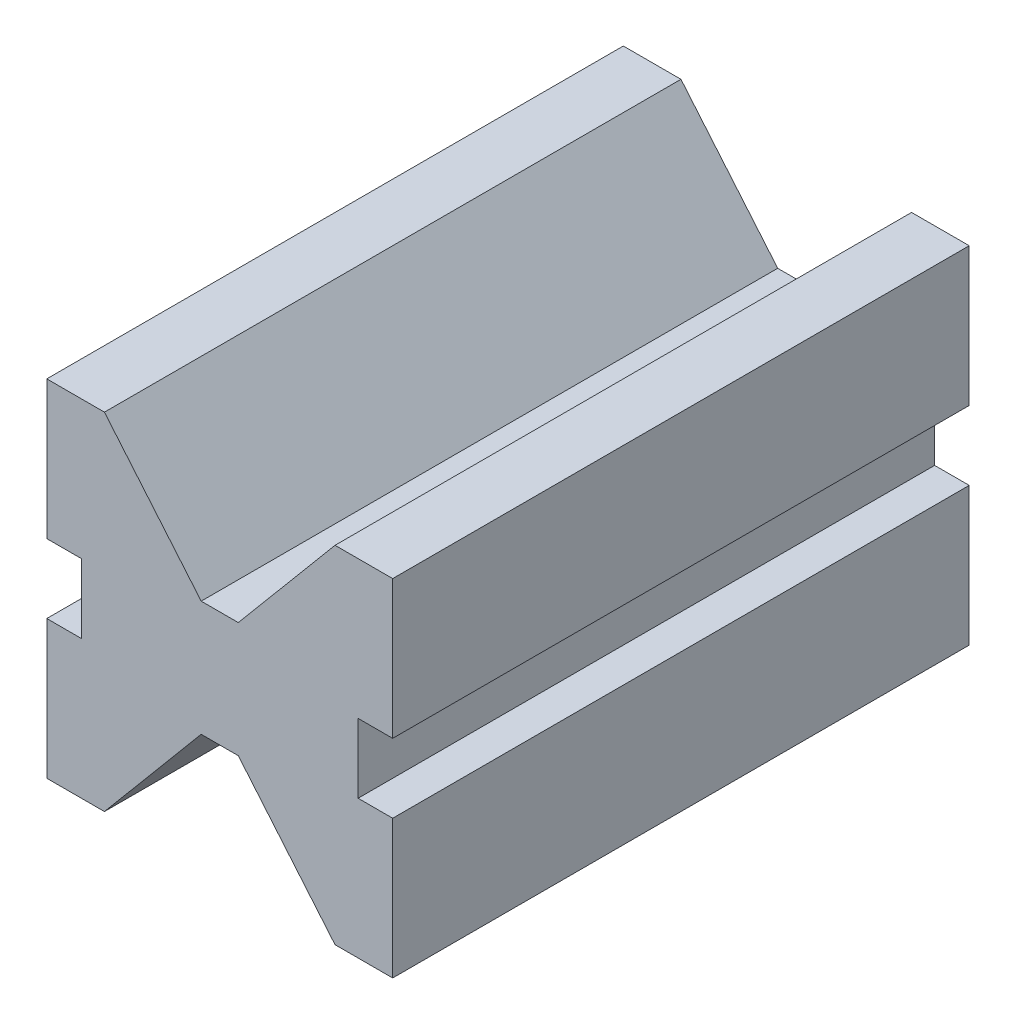
ISO-10303-21;
HEADER;
FILE_DESCRIPTION(('STEP AP214'),'2;1');
FILE_NAME('part.step','',(''),(''),'','','');
FILE_SCHEMA(('AUTOMOTIVE_DESIGN { 1 0 10303 214 1 1 1 1 }'));
ENDSEC;
DATA;
#1=APPLICATION_CONTEXT('core data for automotive mechanical design processes');
#2=APPLICATION_PROTOCOL_DEFINITION('international standard','automotive_design',2000,#1);
#3=PRODUCT_CONTEXT('',#1,'mechanical');
#4=PRODUCT('Part','Part','',(#3));
#5=PRODUCT_RELATED_PRODUCT_CATEGORY('part','',(#4));
#6=PRODUCT_DEFINITION_FORMATION('','',#4);
#7=PRODUCT_DEFINITION_CONTEXT('part definition',#1,'design');
#8=PRODUCT_DEFINITION('design','',#6,#7);
#9=PRODUCT_DEFINITION_SHAPE('','',#8);
#10=(LENGTH_UNIT() NAMED_UNIT(*) SI_UNIT(.MILLI.,.METRE.));
#11=(NAMED_UNIT(*) PLANE_ANGLE_UNIT() SI_UNIT($,.RADIAN.));
#12=(NAMED_UNIT(*) SI_UNIT($,.STERADIAN.) SOLID_ANGLE_UNIT());
#13=UNCERTAINTY_MEASURE_WITH_UNIT(LENGTH_MEASURE(1.E-05),#10,'distance_accuracy_value','');
#14=(GEOMETRIC_REPRESENTATION_CONTEXT(3) GLOBAL_UNCERTAINTY_ASSIGNED_CONTEXT((#13)) GLOBAL_UNIT_ASSIGNED_CONTEXT((#10,
#11,#12)) REPRESENTATION_CONTEXT('',''));
#15=CARTESIAN_POINT('',(0.,0.,0.));
#16=DIRECTION('',(0.,0.,1.));
#17=DIRECTION('',(1.,0.,0.));
#18=AXIS2_PLACEMENT_3D('',#15,#16,#17);
#19=CARTESIAN_POINT('',(30.,0.,50.));
#20=DIRECTION('',(1.,0.,0.));
#21=DIRECTION('',(0.,0.,-1.));
#22=AXIS2_PLACEMENT_3D('',#19,#20,#21);
#23=PLANE('',#22);
#24=DIRECTION('',(0.,-1.,0.));
#25=VECTOR('',#24,1.);
#26=CARTESIAN_POINT('',(30.,0.,-50.));
#27=LINE('',#26,#25);
#28=CARTESIAN_POINT('',(30.,-6.,-50.));
#29=VERTEX_POINT('',#28);
#30=CARTESIAN_POINT('',(30.,-30.,-50.));
#31=VERTEX_POINT('',#30);
#32=EDGE_CURVE('E211',#29,#31,#27,.T.);
#33=ORIENTED_EDGE('',*,*,#32,.F.);
#34=DIRECTION('',(0.,0.,-1.));
#35=VECTOR('',#34,1.);
#36=CARTESIAN_POINT('',(30.,-6.,50.));
#37=LINE('',#36,#35);
#38=CARTESIAN_POINT('',(30.,-6.,50.));
#39=VERTEX_POINT('',#38);
#40=EDGE_CURVE('E11',#39,#29,#37,.T.);
#41=ORIENTED_EDGE('',*,*,#40,.F.);
#42=DIRECTION('',(0.,-1.,0.));
#43=VECTOR('',#42,1.);
#44=CARTESIAN_POINT('',(30.,0.,50.));
#45=LINE('',#44,#43);
#46=CARTESIAN_POINT('',(30.,-30.,50.));
#47=VERTEX_POINT('',#46);
#48=EDGE_CURVE('E282',#39,#47,#45,.T.);
#49=ORIENTED_EDGE('',*,*,#48,.T.);
#50=DIRECTION('',(0.,0.,-1.));
#51=VECTOR('',#50,1.);
#52=CARTESIAN_POINT('',(30.,-30.,50.));
#53=LINE('',#52,#51);
#54=EDGE_CURVE('E128',#47,#31,#53,.T.);
#55=ORIENTED_EDGE('',*,*,#54,.T.);
#56=EDGE_LOOP('',(#33,#41,#49,#55));
#57=FACE_BOUND('',#56,.T.);
#58=ADVANCED_FACE('F41',(#57),#23,.T.);
#59=CARTESIAN_POINT('',(0.,-6.00000000000001,50.));
#60=DIRECTION('',(0.,-1.,0.));
#61=DIRECTION('',(1.,0.,0.));
#62=AXIS2_PLACEMENT_3D('',#59,#60,#61);
#63=PLANE('',#62);
#64=DIRECTION('',(-1.,0.,0.));
#65=VECTOR('',#64,1.);
#66=CARTESIAN_POINT('',(0.,-6.00000000000001,-50.));
#67=LINE('',#66,#65);
#68=CARTESIAN_POINT('',(24.,-6.,-50.));
#69=VERTEX_POINT('',#68);
#70=EDGE_CURVE('E215',#29,#69,#67,.T.);
#71=ORIENTED_EDGE('',*,*,#70,.T.);
#72=DIRECTION('',(0.,0.,-1.));
#73=VECTOR('',#72,1.);
#74=CARTESIAN_POINT('',(24.,-6.,50.));
#75=LINE('',#74,#73);
#76=CARTESIAN_POINT('',(24.,-6.,50.));
#77=VERTEX_POINT('',#76);
#78=EDGE_CURVE('E50',#77,#69,#75,.T.);
#79=ORIENTED_EDGE('',*,*,#78,.F.);
#80=DIRECTION('',(-1.,0.,0.));
#81=VECTOR('',#80,1.);
#82=CARTESIAN_POINT('',(0.,-6.00000000000001,50.));
#83=LINE('',#82,#81);
#84=EDGE_CURVE('E363',#39,#77,#83,.T.);
#85=ORIENTED_EDGE('',*,*,#84,.F.);
#86=ORIENTED_EDGE('',*,*,#40,.T.);
#87=EDGE_LOOP('',(#71,#79,#85,#86));
#88=FACE_BOUND('',#87,.T.);
#89=ADVANCED_FACE('F413',(#88),#63,.F.);
#90=CARTESIAN_POINT('',(24.,0.,50.));
#91=DIRECTION('',(-1.,0.,0.));
#92=DIRECTION('',(0.,0.,1.));
#93=AXIS2_PLACEMENT_3D('',#90,#91,#92);
#94=PLANE('',#93);
#95=DIRECTION('',(0.,1.,0.));
#96=VECTOR('',#95,1.);
#97=CARTESIAN_POINT('',(24.,0.,-50.));
#98=LINE('',#97,#96);
#99=CARTESIAN_POINT('',(24.,6.,-50.));
#100=VERTEX_POINT('',#99);
#101=EDGE_CURVE('E218',#69,#100,#98,.T.);
#102=ORIENTED_EDGE('',*,*,#101,.T.);
#103=DIRECTION('',(0.,0.,-1.));
#104=VECTOR('',#103,1.);
#105=CARTESIAN_POINT('',(24.,6.,50.));
#106=LINE('',#105,#104);
#107=CARTESIAN_POINT('',(24.,6.,50.));
#108=VERTEX_POINT('',#107);
#109=EDGE_CURVE('E331',#108,#100,#106,.T.);
#110=ORIENTED_EDGE('',*,*,#109,.F.);
#111=DIRECTION('',(0.,1.,0.));
#112=VECTOR('',#111,1.);
#113=CARTESIAN_POINT('',(24.,0.,50.));
#114=LINE('',#113,#112);
#115=EDGE_CURVE('E342',#77,#108,#114,.T.);
#116=ORIENTED_EDGE('',*,*,#115,.F.);
#117=ORIENTED_EDGE('',*,*,#78,.T.);
#118=EDGE_LOOP('',(#102,#110,#116,#117));
#119=FACE_BOUND('',#118,.T.);
#120=ADVANCED_FACE('F340',(#119),#94,.F.);
#121=CARTESIAN_POINT('',(0.,6.,50.));
#122=DIRECTION('',(0.,1.,0.));
#123=DIRECTION('',(0.,0.,1.));
#124=AXIS2_PLACEMENT_3D('',#121,#122,#123);
#125=PLANE('',#124);
#126=DIRECTION('',(1.,0.,0.));
#127=VECTOR('',#126,1.);
#128=CARTESIAN_POINT('',(0.,6.,-50.));
#129=LINE('',#128,#127);
#130=CARTESIAN_POINT('',(30.,6.,-50.));
#131=VERTEX_POINT('',#130);
#132=EDGE_CURVE('E221',#100,#131,#129,.T.);
#133=ORIENTED_EDGE('',*,*,#132,.T.);
#134=DIRECTION('',(0.,0.,-1.));
#135=VECTOR('',#134,1.);
#136=CARTESIAN_POINT('',(30.,6.,50.));
#137=LINE('',#136,#135);
#138=CARTESIAN_POINT('',(30.,6.,50.));
#139=VERTEX_POINT('',#138);
#140=EDGE_CURVE('E328',#139,#131,#137,.T.);
#141=ORIENTED_EDGE('',*,*,#140,.F.);
#142=DIRECTION('',(1.,0.,0.));
#143=VECTOR('',#142,1.);
#144=CARTESIAN_POINT('',(0.,6.,50.));
#145=LINE('',#144,#143);
#146=EDGE_CURVE('E354',#108,#139,#145,.T.);
#147=ORIENTED_EDGE('',*,*,#146,.F.);
#148=ORIENTED_EDGE('',*,*,#109,.T.);
#149=EDGE_LOOP('',(#133,#141,#147,#148));
#150=FACE_BOUND('',#149,.T.);
#151=ADVANCED_FACE('F351',(#150),#125,.F.);
#152=CARTESIAN_POINT('',(30.,0.,50.));
#153=DIRECTION('',(1.,0.,0.));
#154=DIRECTION('',(0.,1.,0.));
#155=AXIS2_PLACEMENT_3D('',#152,#153,#154);
#156=PLANE('',#155);
#157=DIRECTION('',(0.,-1.,0.));
#158=VECTOR('',#157,1.);
#159=CARTESIAN_POINT('',(30.,0.,-50.));
#160=LINE('',#159,#158);
#161=CARTESIAN_POINT('',(30.,30.,-50.));
#162=VERTEX_POINT('',#161);
#163=EDGE_CURVE('E225',#162,#131,#160,.T.);
#164=ORIENTED_EDGE('',*,*,#163,.F.);
#165=DIRECTION('',(0.,0.,-1.));
#166=VECTOR('',#165,1.);
#167=CARTESIAN_POINT('',(30.,30.,50.));
#168=LINE('',#167,#166);
#169=CARTESIAN_POINT('',(30.,30.,50.));
#170=VERTEX_POINT('',#169);
#171=EDGE_CURVE('E325',#170,#162,#168,.T.);
#172=ORIENTED_EDGE('',*,*,#171,.F.);
#173=DIRECTION('',(0.,-1.,0.));
#174=VECTOR('',#173,1.);
#175=CARTESIAN_POINT('',(30.,0.,50.));
#176=LINE('',#175,#174);
#177=EDGE_CURVE('E357',#170,#139,#176,.T.);
#178=ORIENTED_EDGE('',*,*,#177,.T.);
#179=ORIENTED_EDGE('',*,*,#140,.T.);
#180=EDGE_LOOP('',(#164,#172,#178,#179));
#181=FACE_BOUND('',#180,.T.);
#182=ADVANCED_FACE('F423',(#181),#156,.T.);
#183=CARTESIAN_POINT('',(0.,30.,50.));
#184=DIRECTION('',(0.,1.,0.));
#185=DIRECTION('',(0.,0.,1.));
#186=AXIS2_PLACEMENT_3D('',#183,#184,#185);
#187=PLANE('',#186);
#188=DIRECTION('',(1.,0.,0.));
#189=VECTOR('',#188,1.);
#190=CARTESIAN_POINT('',(0.,30.,-50.));
#191=LINE('',#190,#189);
#192=CARTESIAN_POINT('',(20.,30.,-50.));
#193=VERTEX_POINT('',#192);
#194=EDGE_CURVE('E229',#193,#162,#191,.T.);
#195=ORIENTED_EDGE('',*,*,#194,.F.);
#196=DIRECTION('',(0.,0.,-1.));
#197=VECTOR('',#196,1.);
#198=CARTESIAN_POINT('',(20.,30.,50.));
#199=LINE('',#198,#197);
#200=CARTESIAN_POINT('',(20.,30.,50.));
#201=VERTEX_POINT('',#200);
#202=EDGE_CURVE('E322',#201,#193,#199,.T.);
#203=ORIENTED_EDGE('',*,*,#202,.F.);
#204=DIRECTION('',(1.,0.,0.));
#205=VECTOR('',#204,1.);
#206=CARTESIAN_POINT('',(0.,30.,50.));
#207=LINE('',#206,#205);
#208=EDGE_CURVE('E361',#201,#170,#207,.T.);
#209=ORIENTED_EDGE('',*,*,#208,.T.);
#210=ORIENTED_EDGE('',*,*,#171,.T.);
#211=EDGE_LOOP('',(#195,#203,#209,#210));
#212=FACE_BOUND('',#211,.T.);
#213=ADVANCED_FACE('F426',(#212),#187,.T.);
#214=CARTESIAN_POINT('',(-3.03563451851394,2.5471998048741,50.));
#215=DIRECTION('',(0.766044443118974,-0.642787609686543,0.));
#216=DIRECTION('',(0.642787609686544,0.766044443118975,0.));
#217=AXIS2_PLACEMENT_3D('',#214,#215,#216);
#218=PLANE('',#217);
#219=DIRECTION('',(-0.642787609686543,-0.766044443118975,0.));
#220=VECTOR('',#219,1.);
#221=CARTESIAN_POINT('',(-3.03563451851394,2.5471998048741,-50.));
#222=LINE('',#221,#220);
#223=CARTESIAN_POINT('',(3.21800737645423,10.,-50.));
#224=VERTEX_POINT('',#223);
#225=EDGE_CURVE('E233',#193,#224,#222,.T.);
#226=ORIENTED_EDGE('',*,*,#225,.T.);
#227=DIRECTION('',(0.,0.,-1.));
#228=VECTOR('',#227,1.);
#229=CARTESIAN_POINT('',(3.21800737645423,10.,50.));
#230=LINE('',#229,#228);
#231=CARTESIAN_POINT('',(3.21800737645423,10.,50.));
#232=VERTEX_POINT('',#231);
#233=EDGE_CURVE('E318',#232,#224,#230,.T.);
#234=ORIENTED_EDGE('',*,*,#233,.F.);
#235=DIRECTION('',(-0.642787609686543,-0.766044443118975,0.));
#236=VECTOR('',#235,1.);
#237=CARTESIAN_POINT('',(-3.03563451851394,2.5471998048741,50.));
#238=LINE('',#237,#236);
#239=EDGE_CURVE('E370',#201,#232,#238,.T.);
#240=ORIENTED_EDGE('',*,*,#239,.F.);
#241=ORIENTED_EDGE('',*,*,#202,.T.);
#242=EDGE_LOOP('',(#226,#234,#240,#241));
#243=FACE_BOUND('',#242,.T.);
#244=ADVANCED_FACE('F430',(#243),#218,.F.);
#245=CARTESIAN_POINT('',(0.,10.,50.));
#246=DIRECTION('',(0.,-1.,0.));
#247=DIRECTION('',(0.,0.,-1.));
#248=AXIS2_PLACEMENT_3D('',#245,#246,#247);
#249=PLANE('',#248);
#250=DIRECTION('',(-1.,0.,0.));
#251=VECTOR('',#250,1.);
#252=CARTESIAN_POINT('',(0.,10.,-50.));
#253=LINE('',#252,#251);
#254=CARTESIAN_POINT('',(-3.2180073764542,10.,-50.));
#255=VERTEX_POINT('',#254);
#256=EDGE_CURVE('E236',#224,#255,#253,.T.);
#257=ORIENTED_EDGE('',*,*,#256,.T.);
#258=DIRECTION('',(0.,0.,-1.));
#259=VECTOR('',#258,1.);
#260=CARTESIAN_POINT('',(-3.2180073764542,10.,50.));
#261=LINE('',#260,#259);
#262=CARTESIAN_POINT('',(-3.2180073764542,10.,50.));
#263=VERTEX_POINT('',#262);
#264=EDGE_CURVE('E314',#263,#255,#261,.T.);
#265=ORIENTED_EDGE('',*,*,#264,.F.);
#266=DIRECTION('',(-1.,0.,0.));
#267=VECTOR('',#266,1.);
#268=CARTESIAN_POINT('',(0.,10.,50.));
#269=LINE('',#268,#267);
#270=EDGE_CURVE('E373',#232,#263,#269,.T.);
#271=ORIENTED_EDGE('',*,*,#270,.F.);
#272=ORIENTED_EDGE('',*,*,#233,.T.);
#273=EDGE_LOOP('',(#257,#265,#271,#272));
#274=FACE_BOUND('',#273,.T.);
#275=ADVANCED_FACE('F434',(#274),#249,.F.);
#276=CARTESIAN_POINT('',(3.03563451851396,2.54719980487411,50.));
#277=DIRECTION('',(-0.766044443118974,-0.642787609686543,0.));
#278=DIRECTION('',(0.642787609686544,-0.766044443118975,0.));
#279=AXIS2_PLACEMENT_3D('',#276,#277,#278);
#280=PLANE('',#279);
#281=DIRECTION('',(-0.642787609686543,0.766044443118975,0.));
#282=VECTOR('',#281,1.);
#283=CARTESIAN_POINT('',(3.03563451851396,2.54719980487411,-50.));
#284=LINE('',#283,#282);
#285=CARTESIAN_POINT('',(-20.,30.,-50.));
#286=VERTEX_POINT('',#285);
#287=EDGE_CURVE('E239',#255,#286,#284,.T.);
#288=ORIENTED_EDGE('',*,*,#287,.T.);
#289=DIRECTION('',(0.,0.,-1.));
#290=VECTOR('',#289,1.);
#291=CARTESIAN_POINT('',(-20.,30.,50.));
#292=LINE('',#291,#290);
#293=CARTESIAN_POINT('',(-20.,30.,50.));
#294=VERTEX_POINT('',#293);
#295=EDGE_CURVE('E311',#294,#286,#292,.T.);
#296=ORIENTED_EDGE('',*,*,#295,.F.);
#297=DIRECTION('',(-0.642787609686543,0.766044443118975,0.));
#298=VECTOR('',#297,1.);
#299=CARTESIAN_POINT('',(3.03563451851396,2.54719980487411,50.));
#300=LINE('',#299,#298);
#301=EDGE_CURVE('E376',#263,#294,#300,.T.);
#302=ORIENTED_EDGE('',*,*,#301,.F.);
#303=ORIENTED_EDGE('',*,*,#264,.T.);
#304=EDGE_LOOP('',(#288,#296,#302,#303));
#305=FACE_BOUND('',#304,.T.);
#306=ADVANCED_FACE('F438',(#305),#280,.F.);
#307=CARTESIAN_POINT('',(0.,30.,50.));
#308=DIRECTION('',(0.,1.,0.));
#309=DIRECTION('',(0.,0.,1.));
#310=AXIS2_PLACEMENT_3D('',#307,#308,#309);
#311=PLANE('',#310);
#312=DIRECTION('',(1.,0.,0.));
#313=VECTOR('',#312,1.);
#314=CARTESIAN_POINT('',(0.,30.,-50.));
#315=LINE('',#314,#313);
#316=CARTESIAN_POINT('',(-30.,30.,-50.));
#317=VERTEX_POINT('',#316);
#318=EDGE_CURVE('E243',#317,#286,#315,.T.);
#319=ORIENTED_EDGE('',*,*,#318,.F.);
#320=DIRECTION('',(0.,0.,-1.));
#321=VECTOR('',#320,1.);
#322=CARTESIAN_POINT('',(-30.,30.,50.));
#323=LINE('',#322,#321);
#324=CARTESIAN_POINT('',(-30.,30.,50.));
#325=VERTEX_POINT('',#324);
#326=EDGE_CURVE('E308',#325,#317,#323,.T.);
#327=ORIENTED_EDGE('',*,*,#326,.F.);
#328=DIRECTION('',(1.,0.,0.));
#329=VECTOR('',#328,1.);
#330=CARTESIAN_POINT('',(0.,30.,50.));
#331=LINE('',#330,#329);
#332=EDGE_CURVE('E379',#325,#294,#331,.T.);
#333=ORIENTED_EDGE('',*,*,#332,.T.);
#334=ORIENTED_EDGE('',*,*,#295,.T.);
#335=EDGE_LOOP('',(#319,#327,#333,#334));
#336=FACE_BOUND('',#335,.T.);
#337=ADVANCED_FACE('F442',(#336),#311,.T.);
#338=CARTESIAN_POINT('',(-30.,0.,50.));
#339=DIRECTION('',(1.,0.,0.));
#340=DIRECTION('',(0.,1.,0.));
#341=AXIS2_PLACEMENT_3D('',#338,#339,#340);
#342=PLANE('',#341);
#343=DIRECTION('',(0.,-1.,0.));
#344=VECTOR('',#343,1.);
#345=CARTESIAN_POINT('',(-30.,0.,-50.));
#346=LINE('',#345,#344);
#347=CARTESIAN_POINT('',(-30.,5.99999999999999,-50.));
#348=VERTEX_POINT('',#347);
#349=EDGE_CURVE('E247',#317,#348,#346,.T.);
#350=ORIENTED_EDGE('',*,*,#349,.T.);
#351=DIRECTION('',(0.,0.,-1.));
#352=VECTOR('',#351,1.);
#353=CARTESIAN_POINT('',(-30.,5.99999999999999,50.));
#354=LINE('',#353,#352);
#355=CARTESIAN_POINT('',(-30.,5.99999999999999,50.));
#356=VERTEX_POINT('',#355);
#357=EDGE_CURVE('E305',#356,#348,#354,.T.);
#358=ORIENTED_EDGE('',*,*,#357,.F.);
#359=DIRECTION('',(0.,-1.,0.));
#360=VECTOR('',#359,1.);
#361=CARTESIAN_POINT('',(-30.,0.,50.));
#362=LINE('',#361,#360);
#363=EDGE_CURVE('E383',#325,#356,#362,.T.);
#364=ORIENTED_EDGE('',*,*,#363,.F.);
#365=ORIENTED_EDGE('',*,*,#326,.T.);
#366=EDGE_LOOP('',(#350,#358,#364,#365));
#367=FACE_BOUND('',#366,.T.);
#368=ADVANCED_FACE('F446',(#367),#342,.F.);
#369=CARTESIAN_POINT('',(0.,5.99999999999999,50.));
#370=DIRECTION('',(0.,-1.,0.));
#371=DIRECTION('',(0.,0.,-1.));
#372=AXIS2_PLACEMENT_3D('',#369,#370,#371);
#373=PLANE('',#372);
#374=DIRECTION('',(-1.,0.,0.));
#375=VECTOR('',#374,1.);
#376=CARTESIAN_POINT('',(0.,5.99999999999999,-50.));
#377=LINE('',#376,#375);
#378=CARTESIAN_POINT('',(-24.,5.99999999999999,-50.));
#379=VERTEX_POINT('',#378);
#380=EDGE_CURVE('E251',#379,#348,#377,.T.);
#381=ORIENTED_EDGE('',*,*,#380,.F.);
#382=DIRECTION('',(0.,0.,-1.));
#383=VECTOR('',#382,1.);
#384=CARTESIAN_POINT('',(-24.,5.99999999999999,50.));
#385=LINE('',#384,#383);
#386=CARTESIAN_POINT('',(-24.,5.99999999999999,50.));
#387=VERTEX_POINT('',#386);
#388=EDGE_CURVE('E302',#387,#379,#385,.T.);
#389=ORIENTED_EDGE('',*,*,#388,.F.);
#390=DIRECTION('',(-1.,0.,0.));
#391=VECTOR('',#390,1.);
#392=CARTESIAN_POINT('',(0.,5.99999999999999,50.));
#393=LINE('',#392,#391);
#394=EDGE_CURVE('E386',#387,#356,#393,.T.);
#395=ORIENTED_EDGE('',*,*,#394,.T.);
#396=ORIENTED_EDGE('',*,*,#357,.T.);
#397=EDGE_LOOP('',(#381,#389,#395,#396));
#398=FACE_BOUND('',#397,.T.);
#399=ADVANCED_FACE('F450',(#398),#373,.T.);
#400=CARTESIAN_POINT('',(-24.,0.,50.));
#401=DIRECTION('',(-1.,0.,0.));
#402=DIRECTION('',(0.,0.,1.));
#403=AXIS2_PLACEMENT_3D('',#400,#401,#402);
#404=PLANE('',#403);
#405=DIRECTION('',(0.,1.,0.));
#406=VECTOR('',#405,1.);
#407=CARTESIAN_POINT('',(-24.,0.,-50.));
#408=LINE('',#407,#406);
#409=CARTESIAN_POINT('',(-24.,-6.,-50.));
#410=VERTEX_POINT('',#409);
#411=EDGE_CURVE('E255',#410,#379,#408,.T.);
#412=ORIENTED_EDGE('',*,*,#411,.F.);
#413=DIRECTION('',(0.,0.,-1.));
#414=VECTOR('',#413,1.);
#415=CARTESIAN_POINT('',(-24.,-6.,50.));
#416=LINE('',#415,#414);
#417=CARTESIAN_POINT('',(-24.,-6.,50.));
#418=VERTEX_POINT('',#417);
#419=EDGE_CURVE('E299',#418,#410,#416,.T.);
#420=ORIENTED_EDGE('',*,*,#419,.F.);
#421=DIRECTION('',(0.,1.,0.));
#422=VECTOR('',#421,1.);
#423=CARTESIAN_POINT('',(-24.,0.,50.));
#424=LINE('',#423,#422);
#425=EDGE_CURVE('E390',#418,#387,#424,.T.);
#426=ORIENTED_EDGE('',*,*,#425,.T.);
#427=ORIENTED_EDGE('',*,*,#388,.T.);
#428=EDGE_LOOP('',(#412,#420,#426,#427));
#429=FACE_BOUND('',#428,.T.);
#430=ADVANCED_FACE('F454',(#429),#404,.T.);
#431=CARTESIAN_POINT('',(0.,-5.99999999999995,50.));
#432=DIRECTION('',(0.,1.,0.));
#433=DIRECTION('',(-1.,0.,0.));
#434=AXIS2_PLACEMENT_3D('',#431,#432,#433);
#435=PLANE('',#434);
#436=DIRECTION('',(1.,0.,0.));
#437=VECTOR('',#436,1.);
#438=CARTESIAN_POINT('',(0.,-5.99999999999995,-50.));
#439=LINE('',#438,#437);
#440=CARTESIAN_POINT('',(-30.,-6.00000000000001,-50.));
#441=VERTEX_POINT('',#440);
#442=EDGE_CURVE('E259',#441,#410,#439,.T.);
#443=ORIENTED_EDGE('',*,*,#442,.F.);
#444=DIRECTION('',(0.,0.,-1.));
#445=VECTOR('',#444,1.);
#446=CARTESIAN_POINT('',(-30.,-6.00000000000001,50.));
#447=LINE('',#446,#445);
#448=CARTESIAN_POINT('',(-30.,-6.00000000000001,50.));
#449=VERTEX_POINT('',#448);
#450=EDGE_CURVE('E296',#449,#441,#447,.T.);
#451=ORIENTED_EDGE('',*,*,#450,.F.);
#452=DIRECTION('',(1.,0.,0.));
#453=VECTOR('',#452,1.);
#454=CARTESIAN_POINT('',(0.,-5.99999999999995,50.));
#455=LINE('',#454,#453);
#456=EDGE_CURVE('E394',#449,#418,#455,.T.);
#457=ORIENTED_EDGE('',*,*,#456,.T.);
#458=ORIENTED_EDGE('',*,*,#419,.T.);
#459=EDGE_LOOP('',(#443,#451,#457,#458));
#460=FACE_BOUND('',#459,.T.);
#461=ADVANCED_FACE('F458',(#460),#435,.T.);
#462=CARTESIAN_POINT('',(-30.,0.,50.));
#463=DIRECTION('',(1.,0.,0.));
#464=DIRECTION('',(0.,1.,0.));
#465=AXIS2_PLACEMENT_3D('',#462,#463,#464);
#466=PLANE('',#465);
#467=DIRECTION('',(0.,-1.,0.));
#468=VECTOR('',#467,1.);
#469=CARTESIAN_POINT('',(-30.,0.,-50.));
#470=LINE('',#469,#468);
#471=CARTESIAN_POINT('',(-30.,-30.,-50.));
#472=VERTEX_POINT('',#471);
#473=EDGE_CURVE('E263',#441,#472,#470,.T.);
#474=ORIENTED_EDGE('',*,*,#473,.T.);
#475=DIRECTION('',(0.,0.,-1.));
#476=VECTOR('',#475,1.);
#477=CARTESIAN_POINT('',(-30.,-30.,50.));
#478=LINE('',#477,#476);
#479=CARTESIAN_POINT('',(-30.,-30.,50.));
#480=VERTEX_POINT('',#479);
#481=EDGE_CURVE('E292',#480,#472,#478,.T.);
#482=ORIENTED_EDGE('',*,*,#481,.F.);
#483=DIRECTION('',(0.,-1.,0.));
#484=VECTOR('',#483,1.);
#485=CARTESIAN_POINT('',(-30.,0.,50.));
#486=LINE('',#485,#484);
#487=EDGE_CURVE('E398',#449,#480,#486,.T.);
#488=ORIENTED_EDGE('',*,*,#487,.F.);
#489=ORIENTED_EDGE('',*,*,#450,.T.);
#490=EDGE_LOOP('',(#474,#482,#488,#489));
#491=FACE_BOUND('',#490,.T.);
#492=ADVANCED_FACE('F462',(#491),#466,.F.);
#493=CARTESIAN_POINT('',(0.,-30.,50.));
#494=DIRECTION('',(0.,1.,0.));
#495=DIRECTION('',(0.,0.,1.));
#496=AXIS2_PLACEMENT_3D('',#493,#494,#495);
#497=PLANE('',#496);
#498=DIRECTION('',(1.,0.,0.));
#499=VECTOR('',#498,1.);
#500=CARTESIAN_POINT('',(0.,-30.,-50.));
#501=LINE('',#500,#499);
#502=CARTESIAN_POINT('',(-20.,-30.,-50.));
#503=VERTEX_POINT('',#502);
#504=EDGE_CURVE('E266',#472,#503,#501,.T.);
#505=ORIENTED_EDGE('',*,*,#504,.T.);
#506=DIRECTION('',(0.,0.,-1.));
#507=VECTOR('',#506,1.);
#508=CARTESIAN_POINT('',(-20.,-30.,50.));
#509=LINE('',#508,#507);
#510=CARTESIAN_POINT('',(-20.,-30.,50.));
#511=VERTEX_POINT('',#510);
#512=EDGE_CURVE('E289',#511,#503,#509,.T.);
#513=ORIENTED_EDGE('',*,*,#512,.F.);
#514=DIRECTION('',(1.,0.,0.));
#515=VECTOR('',#514,1.);
#516=CARTESIAN_POINT('',(0.,-30.,50.));
#517=LINE('',#516,#515);
#518=EDGE_CURVE('E401',#480,#511,#517,.T.);
#519=ORIENTED_EDGE('',*,*,#518,.F.);
#520=ORIENTED_EDGE('',*,*,#481,.T.);
#521=EDGE_LOOP('',(#505,#513,#519,#520));
#522=FACE_BOUND('',#521,.T.);
#523=ADVANCED_FACE('F466',(#522),#497,.F.);
#524=CARTESIAN_POINT('',(3.03563451851397,-2.54719980487412,50.));
#525=DIRECTION('',(0.766044443118974,-0.642787609686543,0.));
#526=DIRECTION('',(0.642787609686544,0.766044443118975,0.));
#527=AXIS2_PLACEMENT_3D('',#524,#525,#526);
#528=PLANE('',#527);
#529=DIRECTION('',(-0.642787609686543,-0.766044443118975,0.));
#530=VECTOR('',#529,1.);
#531=CARTESIAN_POINT('',(3.03563451851397,-2.54719980487412,-50.));
#532=LINE('',#531,#530);
#533=CARTESIAN_POINT('',(-3.2180073764542,-10.,-50.));
#534=VERTEX_POINT('',#533);
#535=EDGE_CURVE('E270',#534,#503,#532,.T.);
#536=ORIENTED_EDGE('',*,*,#535,.F.);
#537=DIRECTION('',(0.,0.,-1.));
#538=VECTOR('',#537,1.);
#539=CARTESIAN_POINT('',(-3.2180073764542,-10.,50.));
#540=LINE('',#539,#538);
#541=CARTESIAN_POINT('',(-3.2180073764542,-10.,50.));
#542=VERTEX_POINT('',#541);
#543=EDGE_CURVE('E195',#542,#534,#540,.T.);
#544=ORIENTED_EDGE('',*,*,#543,.F.);
#545=DIRECTION('',(-0.642787609686543,-0.766044443118975,0.));
#546=VECTOR('',#545,1.);
#547=CARTESIAN_POINT('',(3.03563451851397,-2.54719980487412,50.));
#548=LINE('',#547,#546);
#549=EDGE_CURVE('E201',#542,#511,#548,.T.);
#550=ORIENTED_EDGE('',*,*,#549,.T.);
#551=ORIENTED_EDGE('',*,*,#512,.T.);
#552=EDGE_LOOP('',(#536,#544,#550,#551));
#553=FACE_BOUND('',#552,.T.);
#554=ADVANCED_FACE('F406',(#553),#528,.T.);
#555=CARTESIAN_POINT('',(0.,-10.,50.));
#556=DIRECTION('',(0.,-1.,0.));
#557=DIRECTION('',(0.,0.,-1.));
#558=AXIS2_PLACEMENT_3D('',#555,#556,#557);
#559=PLANE('',#558);
#560=DIRECTION('',(-1.,0.,0.));
#561=VECTOR('',#560,1.);
#562=CARTESIAN_POINT('',(0.,-10.,-50.));
#563=LINE('',#562,#561);
#564=CARTESIAN_POINT('',(3.21800737645423,-10.,-50.));
#565=VERTEX_POINT('',#564);
#566=EDGE_CURVE('E189',#565,#534,#563,.T.);
#567=ORIENTED_EDGE('',*,*,#566,.F.);
#568=DIRECTION('',(0.,0.,-1.));
#569=VECTOR('',#568,1.);
#570=CARTESIAN_POINT('',(3.21800737645423,-10.,50.));
#571=LINE('',#570,#569);
#572=CARTESIAN_POINT('',(3.21800737645423,-10.,50.));
#573=VERTEX_POINT('',#572);
#574=EDGE_CURVE('E184',#573,#565,#571,.T.);
#575=ORIENTED_EDGE('',*,*,#574,.F.);
#576=DIRECTION('',(-1.,0.,0.));
#577=VECTOR('',#576,1.);
#578=CARTESIAN_POINT('',(0.,-10.,50.));
#579=LINE('',#578,#577);
#580=EDGE_CURVE('E187',#573,#542,#579,.T.);
#581=ORIENTED_EDGE('',*,*,#580,.T.);
#582=ORIENTED_EDGE('',*,*,#543,.T.);
#583=EDGE_LOOP('',(#567,#575,#581,#582));
#584=FACE_BOUND('',#583,.T.);
#585=ADVANCED_FACE('F186',(#584),#559,.T.);
#586=CARTESIAN_POINT('',(-3.03563451851395,-2.5471998048741,50.));
#587=DIRECTION('',(-0.766044443118974,-0.642787609686543,0.));
#588=DIRECTION('',(0.642787609686544,-0.766044443118975,0.));
#589=AXIS2_PLACEMENT_3D('',#586,#587,#588);
#590=PLANE('',#589);
#591=DIRECTION('',(-0.642787609686543,0.766044443118975,0.));
#592=VECTOR('',#591,1.);
#593=CARTESIAN_POINT('',(-3.03563451851395,-2.5471998048741,-50.));
#594=LINE('',#593,#592);
#595=CARTESIAN_POINT('',(20.,-30.,-50.));
#596=VERTEX_POINT('',#595);
#597=EDGE_CURVE('E276',#596,#565,#594,.T.);
#598=ORIENTED_EDGE('',*,*,#597,.F.);
#599=DIRECTION('',(0.,0.,-1.));
#600=VECTOR('',#599,1.);
#601=CARTESIAN_POINT('',(20.,-30.,50.));
#602=LINE('',#601,#600);
#603=CARTESIAN_POINT('',(20.,-30.,50.));
#604=VERTEX_POINT('',#603);
#605=EDGE_CURVE('E121',#604,#596,#602,.T.);
#606=ORIENTED_EDGE('',*,*,#605,.F.);
#607=DIRECTION('',(-0.642787609686543,0.766044443118975,0.));
#608=VECTOR('',#607,1.);
#609=CARTESIAN_POINT('',(-3.03563451851395,-2.5471998048741,50.));
#610=LINE('',#609,#608);
#611=EDGE_CURVE('E199',#604,#573,#610,.T.);
#612=ORIENTED_EDGE('',*,*,#611,.T.);
#613=ORIENTED_EDGE('',*,*,#574,.T.);
#614=EDGE_LOOP('',(#598,#606,#612,#613));
#615=FACE_BOUND('',#614,.T.);
#616=ADVANCED_FACE('F204',(#615),#590,.T.);
#617=CARTESIAN_POINT('',(0.,-30.,50.));
#618=DIRECTION('',(0.,1.,0.));
#619=DIRECTION('',(0.,0.,1.));
#620=AXIS2_PLACEMENT_3D('',#617,#618,#619);
#621=PLANE('',#620);
#622=DIRECTION('',(1.,0.,0.));
#623=VECTOR('',#622,1.);
#624=CARTESIAN_POINT('',(0.,-30.,-50.));
#625=LINE('',#624,#623);
#626=EDGE_CURVE('E279',#596,#31,#625,.T.);
#627=ORIENTED_EDGE('',*,*,#626,.T.);
#628=ORIENTED_EDGE('',*,*,#54,.F.);
#629=DIRECTION('',(1.,0.,0.));
#630=VECTOR('',#629,1.);
#631=CARTESIAN_POINT('',(0.,-30.,50.));
#632=LINE('',#631,#630);
#633=EDGE_CURVE('E58',#604,#47,#632,.T.);
#634=ORIENTED_EDGE('',*,*,#633,.F.);
#635=ORIENTED_EDGE('',*,*,#605,.T.);
#636=EDGE_LOOP('',(#627,#628,#634,#635));
#637=FACE_BOUND('',#636,.T.);
#638=ADVANCED_FACE('F409',(#637),#621,.F.);
#639=CARTESIAN_POINT('',(0.,0.,50.));
#640=DIRECTION('',(0.,0.,1.));
#641=DIRECTION('',(1.,0.,0.));
#642=AXIS2_PLACEMENT_3D('',#639,#640,#641);
#643=PLANE('',#642);
#644=ORIENTED_EDGE('',*,*,#48,.F.);
#645=ORIENTED_EDGE('',*,*,#84,.T.);
#646=ORIENTED_EDGE('',*,*,#115,.T.);
#647=ORIENTED_EDGE('',*,*,#146,.T.);
#648=ORIENTED_EDGE('',*,*,#177,.F.);
#649=ORIENTED_EDGE('',*,*,#208,.F.);
#650=ORIENTED_EDGE('',*,*,#239,.T.);
#651=ORIENTED_EDGE('',*,*,#270,.T.);
#652=ORIENTED_EDGE('',*,*,#301,.T.);
#653=ORIENTED_EDGE('',*,*,#332,.F.);
#654=ORIENTED_EDGE('',*,*,#363,.T.);
#655=ORIENTED_EDGE('',*,*,#394,.F.);
#656=ORIENTED_EDGE('',*,*,#425,.F.);
#657=ORIENTED_EDGE('',*,*,#456,.F.);
#658=ORIENTED_EDGE('',*,*,#487,.T.);
#659=ORIENTED_EDGE('',*,*,#518,.T.);
#660=ORIENTED_EDGE('',*,*,#549,.F.);
#661=ORIENTED_EDGE('',*,*,#580,.F.);
#662=ORIENTED_EDGE('',*,*,#611,.F.);
#663=ORIENTED_EDGE('',*,*,#633,.T.);
#664=EDGE_LOOP('',(#644,#645,#646,#647,#648,#649,#650,#651,#652,#653,#654,#655,#656,#657,#658,
#659,#660,#661,#662,#663));
#665=FACE_BOUND('',#664,.T.);
#666=ADVANCED_FACE('F198',(#665),#643,.T.);
#667=CARTESIAN_POINT('',(0.,0.,-50.));
#668=DIRECTION('',(0.,0.,1.));
#669=DIRECTION('',(1.,0.,0.));
#670=AXIS2_PLACEMENT_3D('',#667,#668,#669);
#671=PLANE('',#670);
#672=ORIENTED_EDGE('',*,*,#32,.T.);
#673=ORIENTED_EDGE('',*,*,#626,.F.);
#674=ORIENTED_EDGE('',*,*,#597,.T.);
#675=ORIENTED_EDGE('',*,*,#566,.T.);
#676=ORIENTED_EDGE('',*,*,#535,.T.);
#677=ORIENTED_EDGE('',*,*,#504,.F.);
#678=ORIENTED_EDGE('',*,*,#473,.F.);
#679=ORIENTED_EDGE('',*,*,#442,.T.);
#680=ORIENTED_EDGE('',*,*,#411,.T.);
#681=ORIENTED_EDGE('',*,*,#380,.T.);
#682=ORIENTED_EDGE('',*,*,#349,.F.);
#683=ORIENTED_EDGE('',*,*,#318,.T.);
#684=ORIENTED_EDGE('',*,*,#287,.F.);
#685=ORIENTED_EDGE('',*,*,#256,.F.);
#686=ORIENTED_EDGE('',*,*,#225,.F.);
#687=ORIENTED_EDGE('',*,*,#194,.T.);
#688=ORIENTED_EDGE('',*,*,#163,.T.);
#689=ORIENTED_EDGE('',*,*,#132,.F.);
#690=ORIENTED_EDGE('',*,*,#101,.F.);
#691=ORIENTED_EDGE('',*,*,#70,.F.);
#692=EDGE_LOOP('',(#672,#673,#674,#675,#676,#677,#678,#679,#680,#681,#682,#683,#684,#685,#686,
#687,#688,#689,#690,#691));
#693=FACE_BOUND('',#692,.T.);
#694=ADVANCED_FACE('F347',(#693),#671,.F.);
#695=CLOSED_SHELL('',(#58,#89,#120,#151,#182,#213,#244,#275,#306,#337,#368,#399,#430,#461,#492,
#523,#554,#585,#616,#638,#666,#694));
#696=MANIFOLD_SOLID_BREP('B2',#695);
#697=ADVANCED_BREP_SHAPE_REPRESENTATION('',(#18,#696),#14);
#698=SHAPE_DEFINITION_REPRESENTATION(#9,#697);
ENDSEC;
END-ISO-10303-21;
